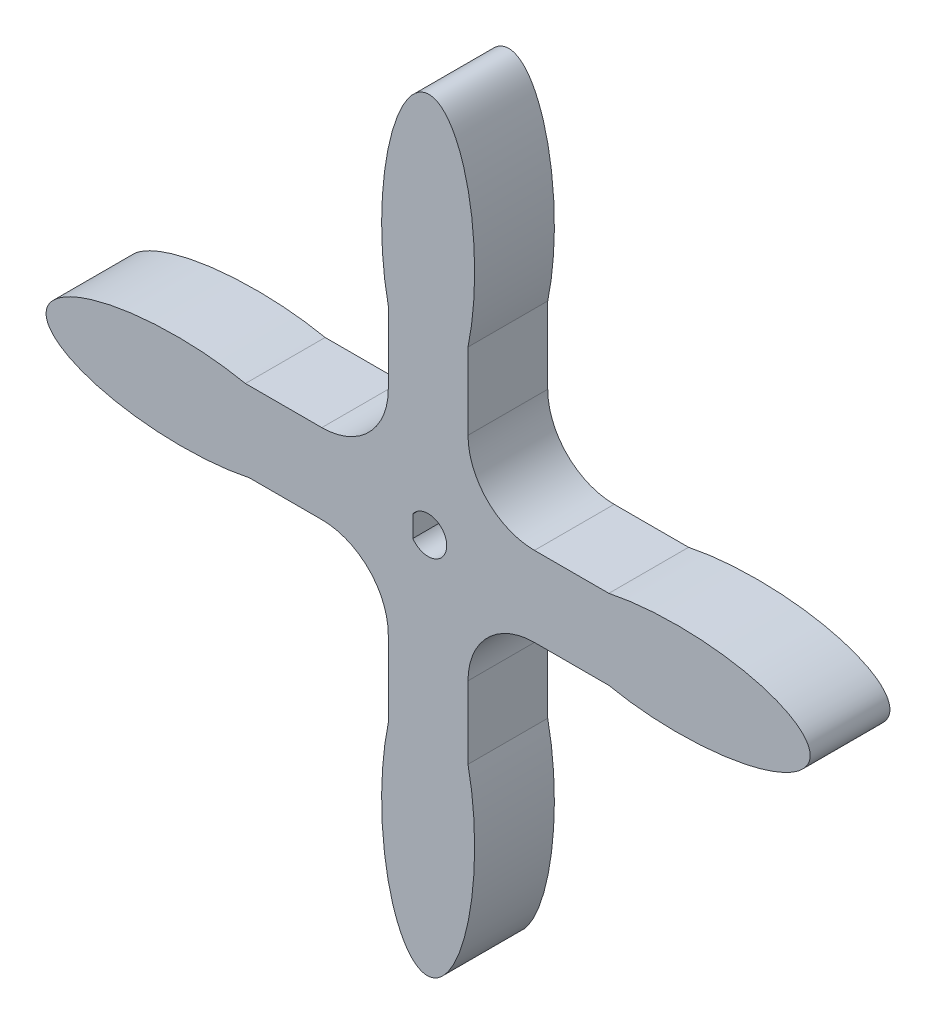
ISO-10303-21;
HEADER;
FILE_DESCRIPTION(('STEP AP214'),'2;1');
FILE_NAME('part.step','',(''),(''),'','','');
FILE_SCHEMA(('AUTOMOTIVE_DESIGN { 1 0 10303 214 1 1 1 1 }'));
ENDSEC;
DATA;
#1=APPLICATION_CONTEXT('core data for automotive mechanical design processes');
#2=APPLICATION_PROTOCOL_DEFINITION('international standard','automotive_design',2000,#1);
#3=PRODUCT_CONTEXT('',#1,'mechanical');
#4=PRODUCT('Part','Part','',(#3));
#5=PRODUCT_RELATED_PRODUCT_CATEGORY('part','',(#4));
#6=PRODUCT_DEFINITION_FORMATION('','',#4);
#7=PRODUCT_DEFINITION_CONTEXT('part definition',#1,'design');
#8=PRODUCT_DEFINITION('design','',#6,#7);
#9=PRODUCT_DEFINITION_SHAPE('','',#8);
#10=(LENGTH_UNIT() NAMED_UNIT(*) SI_UNIT(.MILLI.,.METRE.));
#11=(NAMED_UNIT(*) PLANE_ANGLE_UNIT() SI_UNIT($,.RADIAN.));
#12=(NAMED_UNIT(*) SI_UNIT($,.STERADIAN.) SOLID_ANGLE_UNIT());
#13=UNCERTAINTY_MEASURE_WITH_UNIT(LENGTH_MEASURE(1.E-05),#10,'distance_accuracy_value','');
#14=(GEOMETRIC_REPRESENTATION_CONTEXT(3) GLOBAL_UNCERTAINTY_ASSIGNED_CONTEXT((#13)) GLOBAL_UNIT_ASSIGNED_CONTEXT((#10,
#11,#12)) REPRESENTATION_CONTEXT('',''));
#15=CARTESIAN_POINT('',(0.,0.,0.));
#16=DIRECTION('',(0.,0.,1.));
#17=DIRECTION('',(1.,0.,0.));
#18=AXIS2_PLACEMENT_3D('',#15,#16,#17);
#19=CARTESIAN_POINT('',(-47.5,6.,12.));
#20=DIRECTION('',(0.,-1.,0.));
#21=DIRECTION('',(0.,0.,-1.));
#22=AXIS2_PLACEMENT_3D('',#19,#20,#21);
#23=PLANE('',#22);
#24=DIRECTION('',(-1.,0.,0.));
#25=VECTOR('',#24,1.);
#26=CARTESIAN_POINT('',(-47.5,6.,0.));
#27=LINE('',#26,#25);
#28=CARTESIAN_POINT('',(27.1984249272458,6.,0.));
#29=VERTEX_POINT('',#28);
#30=CARTESIAN_POINT('',(16.,6.,0.));
#31=VERTEX_POINT('',#30);
#32=EDGE_CURVE('E319',#29,#31,#27,.T.);
#33=ORIENTED_EDGE('',*,*,#32,.T.);
#34=DIRECTION('',(0.,0.,1.));
#35=VECTOR('',#34,1.);
#36=CARTESIAN_POINT('',(16.,6.,12.));
#37=LINE('',#36,#35);
#38=CARTESIAN_POINT('',(16.,6.,12.));
#39=VERTEX_POINT('',#38);
#40=EDGE_CURVE('E321',#31,#39,#37,.T.);
#41=ORIENTED_EDGE('',*,*,#40,.T.);
#42=DIRECTION('',(-1.,0.,0.));
#43=VECTOR('',#42,1.);
#44=CARTESIAN_POINT('',(-47.5,6.,12.));
#45=LINE('',#44,#43);
#46=CARTESIAN_POINT('',(27.1984249272458,6.,12.));
#47=VERTEX_POINT('',#46);
#48=EDGE_CURVE('E413',#47,#39,#45,.T.);
#49=ORIENTED_EDGE('',*,*,#48,.F.);
#50=DIRECTION('',(0.,0.,-1.));
#51=VECTOR('',#50,1.);
#52=CARTESIAN_POINT('',(27.1984249272458,6.,6.00000000000002));
#53=LINE('',#52,#51);
#54=EDGE_CURVE('E324',#47,#29,#53,.T.);
#55=ORIENTED_EDGE('',*,*,#54,.T.);
#56=EDGE_LOOP('',(#33,#41,#49,#55));
#57=FACE_BOUND('',#56,.T.);
#58=ADVANCED_FACE('F39',(#57),#23,.F.);
#59=CARTESIAN_POINT('',(-47.5,-6.,12.));
#60=DIRECTION('',(0.,1.,0.));
#61=DIRECTION('',(0.,0.,1.));
#62=AXIS2_PLACEMENT_3D('',#59,#60,#61);
#63=PLANE('',#62);
#64=DIRECTION('',(1.,0.,0.));
#65=VECTOR('',#64,1.);
#66=CARTESIAN_POINT('',(-47.5,-6.,12.));
#67=LINE('',#66,#65);
#68=CARTESIAN_POINT('',(16.,-6.,12.));
#69=VERTEX_POINT('',#68);
#70=CARTESIAN_POINT('',(27.1984249272458,-6.,12.));
#71=VERTEX_POINT('',#70);
#72=EDGE_CURVE('E416',#69,#71,#67,.T.);
#73=ORIENTED_EDGE('',*,*,#72,.F.);
#74=DIRECTION('',(0.,0.,-1.));
#75=VECTOR('',#74,1.);
#76=CARTESIAN_POINT('',(16.,-6.,12.));
#77=LINE('',#76,#75);
#78=CARTESIAN_POINT('',(16.,-6.,0.));
#79=VERTEX_POINT('',#78);
#80=EDGE_CURVE('E360',#69,#79,#77,.T.);
#81=ORIENTED_EDGE('',*,*,#80,.T.);
#82=DIRECTION('',(1.,0.,0.));
#83=VECTOR('',#82,1.);
#84=CARTESIAN_POINT('',(-47.5,-6.,0.));
#85=LINE('',#84,#83);
#86=CARTESIAN_POINT('',(27.1984249272458,-6.,0.));
#87=VERTEX_POINT('',#86);
#88=EDGE_CURVE('E327',#79,#87,#85,.T.);
#89=ORIENTED_EDGE('',*,*,#88,.T.);
#90=DIRECTION('',(0.,0.,-1.));
#91=VECTOR('',#90,1.);
#92=CARTESIAN_POINT('',(27.1984249272458,-6.,6.00000000000002));
#93=LINE('',#92,#91);
#94=EDGE_CURVE('E259',#87,#71,#93,.F.);
#95=ORIENTED_EDGE('',*,*,#94,.T.);
#96=EDGE_LOOP('',(#73,#81,#89,#95));
#97=FACE_BOUND('',#96,.T.);
#98=ADVANCED_FACE('F290',(#97),#63,.F.);
#99=CARTESIAN_POINT('',(-16.,6.,12.));
#100=VERTEX_POINT('',#99);
#101=CARTESIAN_POINT('',(-27.500000000001,6.,12.));
#102=VERTEX_POINT('',#101);
#103=EDGE_CURVE('E394',#100,#102,#45,.T.);
#104=ORIENTED_EDGE('',*,*,#103,.F.);
#105=DIRECTION('',(0.,0.,-1.));
#106=VECTOR('',#105,1.);
#107=CARTESIAN_POINT('',(-16.,6.,12.));
#108=LINE('',#107,#106);
#109=CARTESIAN_POINT('',(-16.,6.,0.));
#110=VERTEX_POINT('',#109);
#111=EDGE_CURVE('E340',#100,#110,#108,.T.);
#112=ORIENTED_EDGE('',*,*,#111,.T.);
#113=CARTESIAN_POINT('',(-27.500000000001,6.,0.));
#114=VERTEX_POINT('',#113);
#115=EDGE_CURVE('E328',#110,#114,#27,.T.);
#116=ORIENTED_EDGE('',*,*,#115,.T.);
#117=DIRECTION('',(0.,0.,-1.));
#118=VECTOR('',#117,1.);
#119=CARTESIAN_POINT('',(-27.500000000001,6.,6.00000000000002));
#120=LINE('',#119,#118);
#121=EDGE_CURVE('E231',#114,#102,#120,.F.);
#122=ORIENTED_EDGE('',*,*,#121,.T.);
#123=EDGE_LOOP('',(#104,#112,#116,#122));
#124=FACE_BOUND('',#123,.T.);
#125=ADVANCED_FACE('F288',(#124),#23,.F.);
#126=CARTESIAN_POINT('',(-26.8888092327717,-6.,0.));
#127=VERTEX_POINT('',#126);
#128=CARTESIAN_POINT('',(-16.,-6.,0.));
#129=VERTEX_POINT('',#128);
#130=EDGE_CURVE('E386',#127,#129,#85,.T.);
#131=ORIENTED_EDGE('',*,*,#130,.T.);
#132=DIRECTION('',(0.,0.,1.));
#133=VECTOR('',#132,1.);
#134=CARTESIAN_POINT('',(-16.,-6.,12.));
#135=LINE('',#134,#133);
#136=CARTESIAN_POINT('',(-16.,-6.,12.));
#137=VERTEX_POINT('',#136);
#138=EDGE_CURVE('E353',#129,#137,#135,.T.);
#139=ORIENTED_EDGE('',*,*,#138,.T.);
#140=CARTESIAN_POINT('',(-26.8888092327717,-6.,12.));
#141=VERTEX_POINT('',#140);
#142=EDGE_CURVE('E343',#141,#137,#67,.T.);
#143=ORIENTED_EDGE('',*,*,#142,.F.);
#144=DIRECTION('',(0.,0.,-1.));
#145=VECTOR('',#144,1.);
#146=CARTESIAN_POINT('',(-26.8888092327717,-6.,6.00000000000002));
#147=LINE('',#146,#145);
#148=EDGE_CURVE('E227',#141,#127,#147,.T.);
#149=ORIENTED_EDGE('',*,*,#148,.T.);
#150=EDGE_LOOP('',(#131,#139,#143,#149));
#151=FACE_BOUND('',#150,.T.);
#152=ADVANCED_FACE('F281',(#151),#63,.F.);
#153=CARTESIAN_POINT('',(0.,0.,12.));
#154=DIRECTION('',(0.,0.,1.));
#155=DIRECTION('',(1.,0.,0.));
#156=AXIS2_PLACEMENT_3D('',#153,#154,#155);
#157=PLANE('',#156);
#158=DIRECTION('',(0.,-1.,0.));
#159=VECTOR('',#158,1.);
#160=CARTESIAN_POINT('',(-2.3,0.,12.));
#161=LINE('',#160,#159);
#162=CARTESIAN_POINT('',(-2.3,1.59687194226713,12.));
#163=VERTEX_POINT('',#162);
#164=CARTESIAN_POINT('',(-2.3,-1.59687194226713,12.));
#165=VERTEX_POINT('',#164);
#166=EDGE_CURVE('E170',#163,#165,#161,.T.);
#167=ORIENTED_EDGE('',*,*,#166,.F.);
#168=CARTESIAN_POINT('',(0.,0.,12.));
#169=DIRECTION('',(0.,0.,1.));
#170=DIRECTION('',(1.,0.,0.));
#171=AXIS2_PLACEMENT_3D('',#168,#169,#170);
#172=CIRCLE('',#171,2.8);
#173=EDGE_CURVE('E182',#165,#163,#172,.T.);
#174=ORIENTED_EDGE('',*,*,#173,.F.);
#175=EDGE_LOOP('',(#167,#174));
#176=FACE_BOUND('',#175,.T.);
#177=ORIENTED_EDGE('',*,*,#142,.T.);
#178=CARTESIAN_POINT('',(-16.,-16.,12.));
#179=DIRECTION('',(0.,0.,1.));
#180=DIRECTION('',(1.,0.,0.));
#181=AXIS2_PLACEMENT_3D('',#178,#179,#180);
#182=CIRCLE('',#181,10.);
#183=CARTESIAN_POINT('',(-6.,-16.,12.));
#184=VERTEX_POINT('',#183);
#185=EDGE_CURVE('E376',#137,#184,#182,.F.);
#186=ORIENTED_EDGE('',*,*,#185,.T.);
#187=DIRECTION('',(0.,-1.,0.));
#188=VECTOR('',#187,1.);
#189=CARTESIAN_POINT('',(-6.,47.5,12.));
#190=LINE('',#189,#188);
#191=CARTESIAN_POINT('',(-6.,-27.5000000000014,12.));
#192=VERTEX_POINT('',#191);
#193=EDGE_CURVE('E397',#184,#192,#190,.T.);
#194=ORIENTED_EDGE('',*,*,#193,.T.);
#195=CARTESIAN_POINT('',(3.91451831640506E-13,-37.5,12.));
#196=DIRECTION('',(0.,0.,-1.));
#197=DIRECTION('',(-0.00711341119371328,-0.999974699370534,0.));
#198=AXIS2_PLACEMENT_3D('',#195,#196,#197);
#199=ELLIPSE('',#198,20.,7.00017710888723);
#200=CARTESIAN_POINT('',(6.00000000000001,-26.8888092327713,12.));
#201=VERTEX_POINT('',#200);
#202=EDGE_CURVE('E200',#201,#192,#199,.T.);
#203=ORIENTED_EDGE('',*,*,#202,.F.);
#204=DIRECTION('',(0.,1.,0.));
#205=VECTOR('',#204,1.);
#206=CARTESIAN_POINT('',(6.,47.5,12.));
#207=LINE('',#206,#205);
#208=CARTESIAN_POINT('',(6.,-16.,12.));
#209=VERTEX_POINT('',#208);
#210=EDGE_CURVE('E403',#201,#209,#207,.T.);
#211=ORIENTED_EDGE('',*,*,#210,.T.);
#212=CARTESIAN_POINT('',(16.,-16.,12.));
#213=DIRECTION('',(0.,0.,1.));
#214=DIRECTION('',(1.,0.,0.));
#215=AXIS2_PLACEMENT_3D('',#212,#213,#214);
#216=CIRCLE('',#215,10.);
#217=EDGE_CURVE('E11',#209,#69,#216,.F.);
#218=ORIENTED_EDGE('',*,*,#217,.T.);
#219=ORIENTED_EDGE('',*,*,#72,.T.);
#220=CARTESIAN_POINT('',(37.5,0.,12.));
#221=DIRECTION('',(0.,0.,-1.));
#222=DIRECTION('',(1.,0.,0.));
#223=AXIS2_PLACEMENT_3D('',#220,#221,#222);
#224=ELLIPSE('',#223,20.,6.99999999999999);
#225=EDGE_CURVE('E255',#47,#71,#224,.T.);
#226=ORIENTED_EDGE('',*,*,#225,.F.);
#227=ORIENTED_EDGE('',*,*,#48,.T.);
#228=CARTESIAN_POINT('',(16.,16.,12.));
#229=DIRECTION('',(0.,0.,1.));
#230=DIRECTION('',(1.,0.,0.));
#231=AXIS2_PLACEMENT_3D('',#228,#229,#230);
#232=CIRCLE('',#231,10.);
#233=CARTESIAN_POINT('',(6.,16.,12.));
#234=VERTEX_POINT('',#233);
#235=EDGE_CURVE('E333',#39,#234,#232,.F.);
#236=ORIENTED_EDGE('',*,*,#235,.T.);
#237=CARTESIAN_POINT('',(6.,27.5000000000004,12.));
#238=VERTEX_POINT('',#237);
#239=EDGE_CURVE('E409',#234,#238,#207,.T.);
#240=ORIENTED_EDGE('',*,*,#239,.T.);
#241=CARTESIAN_POINT('',(-1.26338124709815E-13,37.5,12.));
#242=DIRECTION('',(0.,0.,-1.));
#243=DIRECTION('',(0.00711341119372026,0.999974699370534,0.));
#244=AXIS2_PLACEMENT_3D('',#241,#242,#243);
#245=ELLIPSE('',#244,20.,7.00017710888723);
#246=CARTESIAN_POINT('',(-6.,26.8888092327722,12.));
#247=VERTEX_POINT('',#246);
#248=EDGE_CURVE('E239',#247,#238,#245,.T.);
#249=ORIENTED_EDGE('',*,*,#248,.F.);
#250=CARTESIAN_POINT('',(-6.,16.,12.));
#251=VERTEX_POINT('',#250);
#252=EDGE_CURVE('E402',#247,#251,#190,.T.);
#253=ORIENTED_EDGE('',*,*,#252,.T.);
#254=CARTESIAN_POINT('',(-16.,16.,12.));
#255=DIRECTION('',(0.,0.,1.));
#256=DIRECTION('',(1.,0.,0.));
#257=AXIS2_PLACEMENT_3D('',#254,#255,#256);
#258=CIRCLE('',#257,10.);
#259=EDGE_CURVE('E373',#251,#100,#258,.F.);
#260=ORIENTED_EDGE('',*,*,#259,.T.);
#261=ORIENTED_EDGE('',*,*,#103,.T.);
#262=CARTESIAN_POINT('',(-37.5,-2.57319496893268E-13,12.));
#263=DIRECTION('',(0.,0.,-1.));
#264=DIRECTION('',(-0.999974699370534,0.00711341119371677,0.));
#265=AXIS2_PLACEMENT_3D('',#262,#263,#264);
#266=ELLIPSE('',#265,20.,7.00017710888723);
#267=EDGE_CURVE('E226',#141,#102,#266,.T.);
#268=ORIENTED_EDGE('',*,*,#267,.F.);
#269=EDGE_LOOP('',(#177,#186,#194,#203,#211,#218,#219,#226,#227,#236,#240,#249,#253,#260,#261,#268));
#270=FACE_BOUND('',#269,.T.);
#271=ADVANCED_FACE('F277',(#176,#270),#157,.T.);
#272=CARTESIAN_POINT('',(0.,0.,0.));
#273=DIRECTION('',(0.,0.,1.));
#274=DIRECTION('',(1.,0.,0.));
#275=AXIS2_PLACEMENT_3D('',#272,#273,#274);
#276=PLANE('',#275);
#277=CARTESIAN_POINT('',(0.,0.,0.));
#278=DIRECTION('',(0.,0.,1.));
#279=DIRECTION('',(1.,0.,0.));
#280=AXIS2_PLACEMENT_3D('',#277,#278,#279);
#281=CIRCLE('',#280,1.5);
#282=CARTESIAN_POINT('',(1.5,0.,0.));
#283=VERTEX_POINT('',#282);
#284=EDGE_CURVE('E191',#283,#283,#281,.T.);
#285=ORIENTED_EDGE('',*,*,#284,.T.);
#286=EDGE_LOOP('',(#285));
#287=FACE_BOUND('',#286,.T.);
#288=ORIENTED_EDGE('',*,*,#88,.F.);
#289=CARTESIAN_POINT('',(16.,-16.,0.));
#290=DIRECTION('',(0.,0.,1.));
#291=DIRECTION('',(1.,0.,0.));
#292=AXIS2_PLACEMENT_3D('',#289,#290,#291);
#293=CIRCLE('',#292,10.);
#294=CARTESIAN_POINT('',(6.,-16.,0.));
#295=VERTEX_POINT('',#294);
#296=EDGE_CURVE('E48',#79,#295,#293,.T.);
#297=ORIENTED_EDGE('',*,*,#296,.T.);
#298=DIRECTION('',(0.,-1.,0.));
#299=VECTOR('',#298,1.);
#300=CARTESIAN_POINT('',(6.,47.5,0.));
#301=LINE('',#300,#299);
#302=CARTESIAN_POINT('',(6.,-26.8888092327713,0.));
#303=VERTEX_POINT('',#302);
#304=EDGE_CURVE('E430',#295,#303,#301,.T.);
#305=ORIENTED_EDGE('',*,*,#304,.T.);
#306=CARTESIAN_POINT('',(3.91451831640506E-13,-37.5,0.));
#307=DIRECTION('',(0.,0.,-1.));
#308=DIRECTION('',(-0.00711341119371328,-0.999974699370534,0.));
#309=AXIS2_PLACEMENT_3D('',#306,#307,#308);
#310=ELLIPSE('',#309,20.,7.00017710888723);
#311=CARTESIAN_POINT('',(-6.,-27.5000000000014,0.));
#312=VERTEX_POINT('',#311);
#313=EDGE_CURVE('E195',#303,#312,#310,.T.);
#314=ORIENTED_EDGE('',*,*,#313,.T.);
#315=DIRECTION('',(0.,1.,0.));
#316=VECTOR('',#315,1.);
#317=CARTESIAN_POINT('',(-6.,47.5,0.));
#318=LINE('',#317,#316);
#319=CARTESIAN_POINT('',(-6.,-16.,0.));
#320=VERTEX_POINT('',#319);
#321=EDGE_CURVE('E387',#312,#320,#318,.T.);
#322=ORIENTED_EDGE('',*,*,#321,.T.);
#323=CARTESIAN_POINT('',(-16.,-16.,0.));
#324=DIRECTION('',(0.,0.,1.));
#325=DIRECTION('',(1.,0.,0.));
#326=AXIS2_PLACEMENT_3D('',#323,#324,#325);
#327=CIRCLE('',#326,10.);
#328=EDGE_CURVE('E379',#320,#129,#327,.T.);
#329=ORIENTED_EDGE('',*,*,#328,.T.);
#330=ORIENTED_EDGE('',*,*,#130,.F.);
#331=CARTESIAN_POINT('',(-37.5,-2.57319496893268E-13,0.));
#332=DIRECTION('',(0.,0.,-1.));
#333=DIRECTION('',(-0.999974699370534,0.00711341119371677,0.));
#334=AXIS2_PLACEMENT_3D('',#331,#332,#333);
#335=ELLIPSE('',#334,20.,7.00017710888723);
#336=EDGE_CURVE('E447',#127,#114,#335,.T.);
#337=ORIENTED_EDGE('',*,*,#336,.T.);
#338=ORIENTED_EDGE('',*,*,#115,.F.);
#339=CARTESIAN_POINT('',(-16.,16.,0.));
#340=DIRECTION('',(0.,0.,1.));
#341=DIRECTION('',(1.,0.,0.));
#342=AXIS2_PLACEMENT_3D('',#339,#340,#341);
#343=CIRCLE('',#342,10.);
#344=CARTESIAN_POINT('',(-6.,16.,0.));
#345=VERTEX_POINT('',#344);
#346=EDGE_CURVE('E370',#110,#345,#343,.T.);
#347=ORIENTED_EDGE('',*,*,#346,.T.);
#348=CARTESIAN_POINT('',(-6.,26.8888092327722,0.));
#349=VERTEX_POINT('',#348);
#350=EDGE_CURVE('E408',#345,#349,#318,.T.);
#351=ORIENTED_EDGE('',*,*,#350,.T.);
#352=CARTESIAN_POINT('',(-1.26338124709815E-13,37.5,0.));
#353=DIRECTION('',(0.,0.,-1.));
#354=DIRECTION('',(0.00711341119372026,0.999974699370534,0.));
#355=AXIS2_PLACEMENT_3D('',#352,#353,#354);
#356=ELLIPSE('',#355,20.,7.00017710888723);
#357=CARTESIAN_POINT('',(6.,27.5000000000004,0.));
#358=VERTEX_POINT('',#357);
#359=EDGE_CURVE('E235',#349,#358,#356,.T.);
#360=ORIENTED_EDGE('',*,*,#359,.T.);
#361=CARTESIAN_POINT('',(6.,16.,0.));
#362=VERTEX_POINT('',#361);
#363=EDGE_CURVE('E431',#358,#362,#301,.T.);
#364=ORIENTED_EDGE('',*,*,#363,.T.);
#365=CARTESIAN_POINT('',(16.,16.,0.));
#366=DIRECTION('',(0.,0.,1.));
#367=DIRECTION('',(1.,0.,0.));
#368=AXIS2_PLACEMENT_3D('',#365,#366,#367);
#369=CIRCLE('',#368,10.);
#370=EDGE_CURVE('E332',#362,#31,#369,.T.);
#371=ORIENTED_EDGE('',*,*,#370,.T.);
#372=ORIENTED_EDGE('',*,*,#32,.F.);
#373=CARTESIAN_POINT('',(37.5,0.,0.));
#374=DIRECTION('',(0.,0.,-1.));
#375=DIRECTION('',(1.,0.,0.));
#376=AXIS2_PLACEMENT_3D('',#373,#374,#375);
#377=ELLIPSE('',#376,20.,6.99999999999999);
#378=EDGE_CURVE('E251',#29,#87,#377,.T.);
#379=ORIENTED_EDGE('',*,*,#378,.T.);
#380=EDGE_LOOP('',(#288,#297,#305,#314,#322,#329,#330,#337,#338,#347,#351,#360,#364,#371,#372,#379));
#381=FACE_BOUND('',#380,.T.);
#382=ADVANCED_FACE('F280',(#287,#381),#276,.F.);
#383=CARTESIAN_POINT('',(-6.,47.5,-95.7548954362126));
#384=DIRECTION('',(-1.,0.,0.));
#385=DIRECTION('',(0.,-1.,0.));
#386=AXIS2_PLACEMENT_3D('',#383,#384,#385);
#387=PLANE('',#386);
#388=ORIENTED_EDGE('',*,*,#193,.F.);
#389=DIRECTION('',(0.,0.,1.));
#390=VECTOR('',#389,1.);
#391=CARTESIAN_POINT('',(-6.,-16.,-95.7548954362126));
#392=LINE('',#391,#390);
#393=EDGE_CURVE('E357',#184,#320,#392,.F.);
#394=ORIENTED_EDGE('',*,*,#393,.T.);
#395=ORIENTED_EDGE('',*,*,#321,.F.);
#396=DIRECTION('',(0.,0.,-1.));
#397=VECTOR('',#396,1.);
#398=CARTESIAN_POINT('',(-5.99999999999999,-27.5000000000014,6.00000000000002));
#399=LINE('',#398,#397);
#400=EDGE_CURVE('E204',#192,#312,#399,.T.);
#401=ORIENTED_EDGE('',*,*,#400,.F.);
#402=EDGE_LOOP('',(#388,#394,#395,#401));
#403=FACE_BOUND('',#402,.T.);
#404=ADVANCED_FACE('F272',(#403),#387,.T.);
#405=CARTESIAN_POINT('',(6.,47.5,-95.7548954362126));
#406=DIRECTION('',(1.,0.,0.));
#407=DIRECTION('',(0.,1.,0.));
#408=AXIS2_PLACEMENT_3D('',#405,#406,#407);
#409=PLANE('',#408);
#410=ORIENTED_EDGE('',*,*,#304,.F.);
#411=DIRECTION('',(0.,0.,-1.));
#412=VECTOR('',#411,1.);
#413=CARTESIAN_POINT('',(6.,-16.,-95.7548954362126));
#414=LINE('',#413,#412);
#415=EDGE_CURVE('E55',#295,#209,#414,.F.);
#416=ORIENTED_EDGE('',*,*,#415,.T.);
#417=ORIENTED_EDGE('',*,*,#210,.F.);
#418=DIRECTION('',(0.,0.,-1.));
#419=VECTOR('',#418,1.);
#420=CARTESIAN_POINT('',(6.00000000000001,-26.8888092327713,6.00000000000002));
#421=LINE('',#420,#419);
#422=EDGE_CURVE('E336',#303,#201,#421,.F.);
#423=ORIENTED_EDGE('',*,*,#422,.F.);
#424=EDGE_LOOP('',(#410,#416,#417,#423));
#425=FACE_BOUND('',#424,.T.);
#426=ADVANCED_FACE('F275',(#425),#409,.T.);
#427=ORIENTED_EDGE('',*,*,#239,.F.);
#428=DIRECTION('',(0.,0.,1.));
#429=VECTOR('',#428,1.);
#430=CARTESIAN_POINT('',(6.,16.,-95.7548954362126));
#431=LINE('',#430,#429);
#432=EDGE_CURVE('E335',#234,#362,#431,.F.);
#433=ORIENTED_EDGE('',*,*,#432,.T.);
#434=ORIENTED_EDGE('',*,*,#363,.F.);
#435=DIRECTION('',(0.,0.,-1.));
#436=VECTOR('',#435,1.);
#437=CARTESIAN_POINT('',(6.,27.5000000000005,6.00000000000002));
#438=LINE('',#437,#436);
#439=EDGE_CURVE('E248',#238,#358,#438,.T.);
#440=ORIENTED_EDGE('',*,*,#439,.F.);
#441=EDGE_LOOP('',(#427,#433,#434,#440));
#442=FACE_BOUND('',#441,.T.);
#443=ADVANCED_FACE('F270',(#442),#409,.T.);
#444=ORIENTED_EDGE('',*,*,#350,.F.);
#445=DIRECTION('',(0.,0.,-1.));
#446=VECTOR('',#445,1.);
#447=CARTESIAN_POINT('',(-6.,16.,-95.7548954362126));
#448=LINE('',#447,#446);
#449=EDGE_CURVE('E350',#345,#251,#448,.F.);
#450=ORIENTED_EDGE('',*,*,#449,.T.);
#451=ORIENTED_EDGE('',*,*,#252,.F.);
#452=DIRECTION('',(0.,0.,-1.));
#453=VECTOR('',#452,1.);
#454=CARTESIAN_POINT('',(-6.,26.8888092327722,6.00000000000002));
#455=LINE('',#454,#453);
#456=EDGE_CURVE('E242',#349,#247,#455,.F.);
#457=ORIENTED_EDGE('',*,*,#456,.F.);
#458=EDGE_LOOP('',(#444,#450,#451,#457));
#459=FACE_BOUND('',#458,.T.);
#460=ADVANCED_FACE('F266',(#459),#387,.T.);
#461=CARTESIAN_POINT('',(37.5,0.,54.3793572181452));
#462=DIRECTION('',(0.,0.,-1.));
#463=DIRECTION('',(1.,0.,0.));
#464=AXIS2_PLACEMENT_3D('',#461,#462,#463);
#465=ELLIPSE('',#464,20.,6.99999999999999);
#466=DIRECTION('',(0.,0.,-1.));
#467=VECTOR('',#466,1.);
#468=SURFACE_OF_LINEAR_EXTRUSION('',#465,#467);
#469=ORIENTED_EDGE('',*,*,#54,.F.);
#470=ORIENTED_EDGE('',*,*,#225,.T.);
#471=ORIENTED_EDGE('',*,*,#94,.F.);
#472=ORIENTED_EDGE('',*,*,#378,.F.);
#473=EDGE_LOOP('',(#469,#470,#471,#472));
#474=FACE_BOUND('',#473,.T.);
#475=ADVANCED_FACE('F263',(#474),#468,.T.);
#476=CARTESIAN_POINT('',(-1.26338124709815E-13,37.5,54.3793572181452));
#477=DIRECTION('',(0.,0.,-1.));
#478=DIRECTION('',(0.00711341119372026,0.999974699370534,0.));
#479=AXIS2_PLACEMENT_3D('',#476,#477,#478);
#480=ELLIPSE('',#479,20.,7.00017710888723);
#481=DIRECTION('',(0.,0.,-1.));
#482=VECTOR('',#481,1.);
#483=SURFACE_OF_LINEAR_EXTRUSION('',#480,#482);
#484=ORIENTED_EDGE('',*,*,#248,.T.);
#485=ORIENTED_EDGE('',*,*,#439,.T.);
#486=ORIENTED_EDGE('',*,*,#359,.F.);
#487=ORIENTED_EDGE('',*,*,#456,.T.);
#488=EDGE_LOOP('',(#484,#485,#486,#487));
#489=FACE_BOUND('',#488,.T.);
#490=ADVANCED_FACE('F219',(#489),#483,.T.);
#491=CARTESIAN_POINT('',(-37.5,-2.57319496893268E-13,54.3793572181452));
#492=DIRECTION('',(0.,0.,-1.));
#493=DIRECTION('',(-0.999974699370534,0.00711341119371677,0.));
#494=AXIS2_PLACEMENT_3D('',#491,#492,#493);
#495=ELLIPSE('',#494,20.,7.00017710888723);
#496=DIRECTION('',(0.,0.,-1.));
#497=VECTOR('',#496,1.);
#498=SURFACE_OF_LINEAR_EXTRUSION('',#495,#497);
#499=ORIENTED_EDGE('',*,*,#121,.F.);
#500=ORIENTED_EDGE('',*,*,#336,.F.);
#501=ORIENTED_EDGE('',*,*,#148,.F.);
#502=ORIENTED_EDGE('',*,*,#267,.T.);
#503=EDGE_LOOP('',(#499,#500,#501,#502));
#504=FACE_BOUND('',#503,.T.);
#505=ADVANCED_FACE('F213',(#504),#498,.T.);
#506=CARTESIAN_POINT('',(3.91451831640506E-13,-37.5,54.3793572181452));
#507=DIRECTION('',(0.,0.,-1.));
#508=DIRECTION('',(-0.00711341119371328,-0.999974699370534,0.));
#509=AXIS2_PLACEMENT_3D('',#506,#507,#508);
#510=ELLIPSE('',#509,20.,7.00017710888723);
#511=DIRECTION('',(0.,0.,-1.));
#512=VECTOR('',#511,1.);
#513=SURFACE_OF_LINEAR_EXTRUSION('',#510,#512);
#514=ORIENTED_EDGE('',*,*,#202,.T.);
#515=ORIENTED_EDGE('',*,*,#400,.T.);
#516=ORIENTED_EDGE('',*,*,#313,.F.);
#517=ORIENTED_EDGE('',*,*,#422,.T.);
#518=EDGE_LOOP('',(#514,#515,#516,#517));
#519=FACE_BOUND('',#518,.T.);
#520=ADVANCED_FACE('F209',(#519),#513,.T.);
#521=CARTESIAN_POINT('',(-2.3,0.,1.5));
#522=DIRECTION('',(-1.,0.,0.));
#523=DIRECTION('',(0.,0.,1.));
#524=AXIS2_PLACEMENT_3D('',#521,#522,#523);
#525=PLANE('',#524);
#526=ORIENTED_EDGE('',*,*,#166,.T.);
#527=DIRECTION('',(0.,0.,1.));
#528=VECTOR('',#527,1.);
#529=CARTESIAN_POINT('',(-2.3,-1.59687194226713,1.5));
#530=LINE('',#529,#528);
#531=CARTESIAN_POINT('',(-2.3,-1.59687194226713,1.5));
#532=VERTEX_POINT('',#531);
#533=EDGE_CURVE('E164',#532,#165,#530,.T.);
#534=ORIENTED_EDGE('',*,*,#533,.F.);
#535=DIRECTION('',(0.,-1.,0.));
#536=VECTOR('',#535,1.);
#537=CARTESIAN_POINT('',(-2.3,0.,1.5));
#538=LINE('',#537,#536);
#539=CARTESIAN_POINT('',(-2.3,1.59687194226713,1.5));
#540=VERTEX_POINT('',#539);
#541=EDGE_CURVE('E167',#540,#532,#538,.T.);
#542=ORIENTED_EDGE('',*,*,#541,.F.);
#543=DIRECTION('',(0.,0.,1.));
#544=VECTOR('',#543,1.);
#545=CARTESIAN_POINT('',(-2.3,1.59687194226713,1.5));
#546=LINE('',#545,#544);
#547=EDGE_CURVE('E176',#540,#163,#546,.T.);
#548=ORIENTED_EDGE('',*,*,#547,.T.);
#549=EDGE_LOOP('',(#526,#534,#542,#548));
#550=FACE_BOUND('',#549,.T.);
#551=ADVANCED_FACE('F166',(#550),#525,.F.);
#552=CARTESIAN_POINT('',(0.,0.,1.5));
#553=DIRECTION('',(0.,0.,1.));
#554=DIRECTION('',(1.,0.,0.));
#555=AXIS2_PLACEMENT_3D('',#552,#553,#554);
#556=CYLINDRICAL_SURFACE('',#555,2.8);
#557=ORIENTED_EDGE('',*,*,#173,.T.);
#558=ORIENTED_EDGE('',*,*,#547,.F.);
#559=CARTESIAN_POINT('',(0.,0.,1.5));
#560=DIRECTION('',(0.,0.,1.));
#561=DIRECTION('',(1.,0.,0.));
#562=AXIS2_PLACEMENT_3D('',#559,#560,#561);
#563=CIRCLE('',#562,2.8);
#564=EDGE_CURVE('E177',#532,#540,#563,.T.);
#565=ORIENTED_EDGE('',*,*,#564,.F.);
#566=ORIENTED_EDGE('',*,*,#533,.T.);
#567=EDGE_LOOP('',(#557,#558,#565,#566));
#568=FACE_BOUND('',#567,.T.);
#569=ADVANCED_FACE('F184',(#568),#556,.F.);
#570=CARTESIAN_POINT('',(0.,0.,1.5));
#571=DIRECTION('',(0.,0.,1.));
#572=DIRECTION('',(1.,0.,0.));
#573=AXIS2_PLACEMENT_3D('',#570,#571,#572);
#574=PLANE('',#573);
#575=CARTESIAN_POINT('',(0.,0.,1.5));
#576=DIRECTION('',(0.,0.,1.));
#577=DIRECTION('',(1.,0.,0.));
#578=AXIS2_PLACEMENT_3D('',#575,#576,#577);
#579=CIRCLE('',#578,1.5);
#580=CARTESIAN_POINT('',(1.5,0.,1.5));
#581=VERTEX_POINT('',#580);
#582=EDGE_CURVE('E634',#581,#581,#579,.T.);
#583=ORIENTED_EDGE('',*,*,#582,.F.);
#584=EDGE_LOOP('',(#583));
#585=FACE_BOUND('',#584,.T.);
#586=ORIENTED_EDGE('',*,*,#541,.T.);
#587=ORIENTED_EDGE('',*,*,#564,.T.);
#588=EDGE_LOOP('',(#586,#587));
#589=FACE_BOUND('',#588,.T.);
#590=ADVANCED_FACE('F180',(#585,#589),#574,.T.);
#591=CARTESIAN_POINT('',(16.,16.,12.));
#592=DIRECTION('',(0.,0.,1.));
#593=DIRECTION('',(1.,0.,0.));
#594=AXIS2_PLACEMENT_3D('',#591,#592,#593);
#595=CYLINDRICAL_SURFACE('',#594,10.);
#596=ORIENTED_EDGE('',*,*,#370,.F.);
#597=ORIENTED_EDGE('',*,*,#432,.F.);
#598=ORIENTED_EDGE('',*,*,#235,.F.);
#599=ORIENTED_EDGE('',*,*,#40,.F.);
#600=EDGE_LOOP('',(#596,#597,#598,#599));
#601=FACE_BOUND('',#600,.T.);
#602=ADVANCED_FACE('F294',(#601),#595,.F.);
#603=CARTESIAN_POINT('',(-16.,16.,12.));
#604=DIRECTION('',(0.,0.,-1.));
#605=DIRECTION('',(-1.,0.,0.));
#606=AXIS2_PLACEMENT_3D('',#603,#604,#605);
#607=CYLINDRICAL_SURFACE('',#606,10.);
#608=ORIENTED_EDGE('',*,*,#259,.F.);
#609=ORIENTED_EDGE('',*,*,#449,.F.);
#610=ORIENTED_EDGE('',*,*,#346,.F.);
#611=ORIENTED_EDGE('',*,*,#111,.F.);
#612=EDGE_LOOP('',(#608,#609,#610,#611));
#613=FACE_BOUND('',#612,.T.);
#614=ADVANCED_FACE('F297',(#613),#607,.F.);
#615=CARTESIAN_POINT('',(-16.,-16.,12.));
#616=DIRECTION('',(0.,0.,1.));
#617=DIRECTION('',(1.,0.,0.));
#618=AXIS2_PLACEMENT_3D('',#615,#616,#617);
#619=CYLINDRICAL_SURFACE('',#618,10.);
#620=ORIENTED_EDGE('',*,*,#328,.F.);
#621=ORIENTED_EDGE('',*,*,#393,.F.);
#622=ORIENTED_EDGE('',*,*,#185,.F.);
#623=ORIENTED_EDGE('',*,*,#138,.F.);
#624=EDGE_LOOP('',(#620,#621,#622,#623));
#625=FACE_BOUND('',#624,.T.);
#626=ADVANCED_FACE('F300',(#625),#619,.F.);
#627=CARTESIAN_POINT('',(16.,-16.,12.));
#628=DIRECTION('',(0.,0.,-1.));
#629=DIRECTION('',(-1.,0.,0.));
#630=AXIS2_PLACEMENT_3D('',#627,#628,#629);
#631=CYLINDRICAL_SURFACE('',#630,10.);
#632=ORIENTED_EDGE('',*,*,#217,.F.);
#633=ORIENTED_EDGE('',*,*,#415,.F.);
#634=ORIENTED_EDGE('',*,*,#296,.F.);
#635=ORIENTED_EDGE('',*,*,#80,.F.);
#636=EDGE_LOOP('',(#632,#633,#634,#635));
#637=FACE_BOUND('',#636,.T.);
#638=ADVANCED_FACE('F41',(#637),#631,.F.);
#639=CARTESIAN_POINT('',(0.,0.,0.));
#640=DIRECTION('',(0.,0.,1.));
#641=DIRECTION('',(1.,0.,0.));
#642=AXIS2_PLACEMENT_3D('',#639,#640,#641);
#643=CYLINDRICAL_SURFACE('',#642,1.5);
#644=ORIENTED_EDGE('',*,*,#284,.F.);
#645=EDGE_LOOP('',(#644));
#646=FACE_BOUND('',#645,.T.);
#647=ORIENTED_EDGE('',*,*,#582,.T.);
#648=EDGE_LOOP('',(#647));
#649=FACE_BOUND('',#648,.T.);
#650=ADVANCED_FACE('F307',(#646,#649),#643,.F.);
#651=CLOSED_SHELL('',(#58,#98,#125,#152,#271,#382,#404,#426,#443,#460,#475,#490,#505,#520,#551,
#569,#590,#602,#614,#626,#638,#650));
#652=MANIFOLD_SOLID_BREP('B2',#651);
#653=ADVANCED_BREP_SHAPE_REPRESENTATION('',(#18,#652),#14);
#654=SHAPE_DEFINITION_REPRESENTATION(#9,#653);
ENDSEC;
END-ISO-10303-21;
